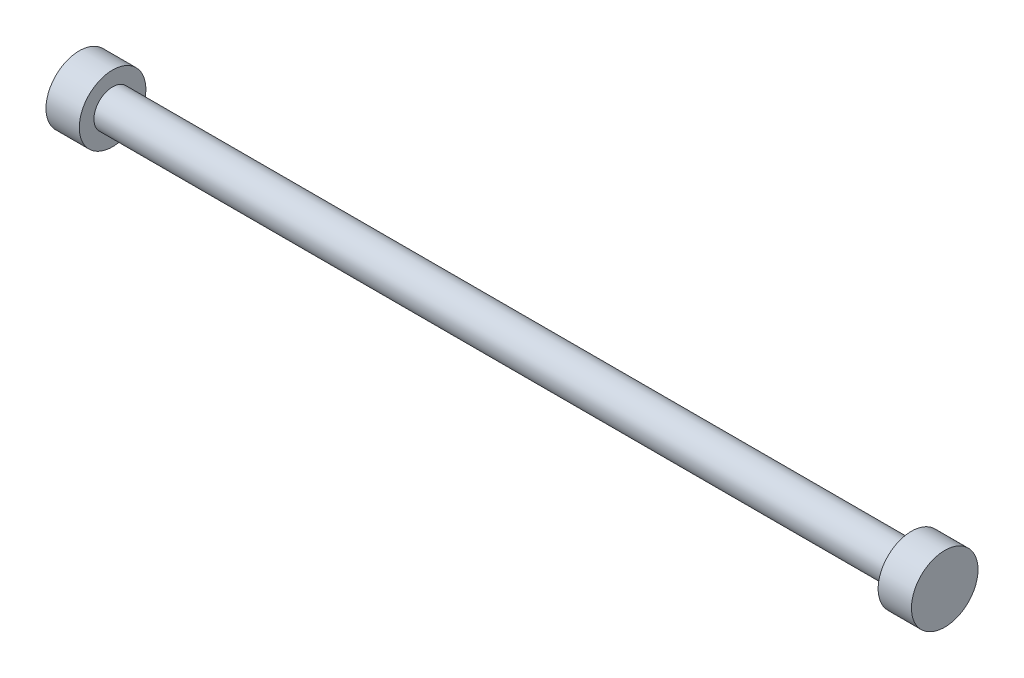
ISO-10303-21;
HEADER;
FILE_DESCRIPTION(('STEP AP214'),'2;1');
FILE_NAME('part.step','',(''),(''),'','','');
FILE_SCHEMA(('AUTOMOTIVE_DESIGN { 1 0 10303 214 1 1 1 1 }'));
ENDSEC;
DATA;
#1=APPLICATION_CONTEXT('core data for automotive mechanical design processes');
#2=APPLICATION_PROTOCOL_DEFINITION('international standard','automotive_design',2000,#1);
#3=PRODUCT_CONTEXT('',#1,'mechanical');
#4=PRODUCT('Part','Part','',(#3));
#5=PRODUCT_RELATED_PRODUCT_CATEGORY('part','',(#4));
#6=PRODUCT_DEFINITION_FORMATION('','',#4);
#7=PRODUCT_DEFINITION_CONTEXT('part definition',#1,'design');
#8=PRODUCT_DEFINITION('design','',#6,#7);
#9=PRODUCT_DEFINITION_SHAPE('','',#8);
#10=(LENGTH_UNIT() NAMED_UNIT(*) SI_UNIT(.MILLI.,.METRE.));
#11=(NAMED_UNIT(*) PLANE_ANGLE_UNIT() SI_UNIT($,.RADIAN.));
#12=(NAMED_UNIT(*) SI_UNIT($,.STERADIAN.) SOLID_ANGLE_UNIT());
#13=UNCERTAINTY_MEASURE_WITH_UNIT(LENGTH_MEASURE(1.E-05),#10,'distance_accuracy_value','');
#14=(GEOMETRIC_REPRESENTATION_CONTEXT(3) GLOBAL_UNCERTAINTY_ASSIGNED_CONTEXT((#13)) GLOBAL_UNIT_ASSIGNED_CONTEXT((#10,
#11,#12)) REPRESENTATION_CONTEXT('',''));
#15=CARTESIAN_POINT('',(0.,0.,0.));
#16=DIRECTION('',(0.,0.,1.));
#17=DIRECTION('',(1.,0.,0.));
#18=AXIS2_PLACEMENT_3D('',#15,#16,#17);
#19=CARTESIAN_POINT('',(76.2,0.,0.));
#20=DIRECTION('',(-1.,0.,0.));
#21=DIRECTION('',(0.,0.,1.));
#22=AXIS2_PLACEMENT_3D('',#19,#20,#21);
#23=CYLINDRICAL_SURFACE('',#22,1.778);
#24=CARTESIAN_POINT('',(76.2,0.,0.));
#25=DIRECTION('',(1.,0.,0.));
#26=DIRECTION('',(0.,0.,-1.));
#27=AXIS2_PLACEMENT_3D('',#24,#25,#26);
#28=CIRCLE('',#27,1.778);
#29=CARTESIAN_POINT('',(76.2,0.,1.778));
#30=VERTEX_POINT('',#29);
#31=EDGE_CURVE('E10',#30,#30,#28,.T.);
#32=CARTESIAN_POINT('',(0.,0.,0.));
#33=DIRECTION('',(1.,0.,0.));
#34=DIRECTION('',(0.,0.,-1.));
#35=AXIS2_PLACEMENT_3D('',#32,#33,#34);
#36=CIRCLE('',#35,1.778);
#37=CARTESIAN_POINT('',(0.,0.,1.778));
#38=VERTEX_POINT('',#37);
#39=EDGE_CURVE('E37',#38,#38,#36,.T.);
#40=CARTESIAN_POINT('',(76.2,0.,1.778));
#41=CARTESIAN_POINT('',(75.40625,0.,1.778));
#42=CARTESIAN_POINT('',(74.6125,0.,1.778));
#43=CARTESIAN_POINT('',(73.025,0.,1.778));
#44=CARTESIAN_POINT('',(72.23125,0.,1.778));
#45=CARTESIAN_POINT('',(70.64375,0.,1.778));
#46=CARTESIAN_POINT('',(69.85,0.,1.778));
#47=CARTESIAN_POINT('',(68.2625,0.,1.778));
#48=CARTESIAN_POINT('',(67.46875,0.,1.778));
#49=CARTESIAN_POINT('',(65.88125,0.,1.778));
#50=CARTESIAN_POINT('',(65.0875,0.,1.778));
#51=CARTESIAN_POINT('',(63.5,0.,1.778));
#52=CARTESIAN_POINT('',(62.70625,0.,1.778));
#53=CARTESIAN_POINT('',(61.11875,0.,1.778));
#54=CARTESIAN_POINT('',(60.325,0.,1.778));
#55=CARTESIAN_POINT('',(58.7375,0.,1.778));
#56=CARTESIAN_POINT('',(57.94375,0.,1.778));
#57=CARTESIAN_POINT('',(56.35625,0.,1.778));
#58=CARTESIAN_POINT('',(55.5625,0.,1.778));
#59=CARTESIAN_POINT('',(53.975,0.,1.778));
#60=CARTESIAN_POINT('',(53.18125,0.,1.778));
#61=CARTESIAN_POINT('',(51.59375,0.,1.778));
#62=CARTESIAN_POINT('',(50.8,0.,1.778));
#63=CARTESIAN_POINT('',(49.2125,0.,1.778));
#64=CARTESIAN_POINT('',(48.41875,0.,1.778));
#65=CARTESIAN_POINT('',(46.83125,0.,1.778));
#66=CARTESIAN_POINT('',(46.0375,0.,1.778));
#67=CARTESIAN_POINT('',(44.45,0.,1.778));
#68=CARTESIAN_POINT('',(43.65625,0.,1.778));
#69=CARTESIAN_POINT('',(42.06875,0.,1.778));
#70=CARTESIAN_POINT('',(41.275,0.,1.778));
#71=CARTESIAN_POINT('',(39.6875,0.,1.778));
#72=CARTESIAN_POINT('',(38.89375,0.,1.778));
#73=CARTESIAN_POINT('',(37.30625,0.,1.778));
#74=CARTESIAN_POINT('',(36.5125,0.,1.778));
#75=CARTESIAN_POINT('',(34.925,0.,1.778));
#76=CARTESIAN_POINT('',(34.13125,0.,1.778));
#77=CARTESIAN_POINT('',(32.54375,0.,1.778));
#78=CARTESIAN_POINT('',(31.75,0.,1.778));
#79=CARTESIAN_POINT('',(30.1625,0.,1.778));
#80=CARTESIAN_POINT('',(29.36875,0.,1.778));
#81=CARTESIAN_POINT('',(27.78125,0.,1.778));
#82=CARTESIAN_POINT('',(26.9875,0.,1.778));
#83=CARTESIAN_POINT('',(25.4,0.,1.778));
#84=CARTESIAN_POINT('',(24.60625,0.,1.778));
#85=CARTESIAN_POINT('',(23.01875,0.,1.778));
#86=CARTESIAN_POINT('',(22.225,0.,1.778));
#87=CARTESIAN_POINT('',(20.6375,0.,1.778));
#88=CARTESIAN_POINT('',(19.84375,0.,1.778));
#89=CARTESIAN_POINT('',(18.25625,0.,1.778));
#90=CARTESIAN_POINT('',(17.4625,0.,1.778));
#91=CARTESIAN_POINT('',(15.875,0.,1.778));
#92=CARTESIAN_POINT('',(15.08125,0.,1.778));
#93=CARTESIAN_POINT('',(13.49375,0.,1.778));
#94=CARTESIAN_POINT('',(12.7,0.,1.778));
#95=CARTESIAN_POINT('',(11.1125,0.,1.778));
#96=CARTESIAN_POINT('',(10.31875,0.,1.778));
#97=CARTESIAN_POINT('',(8.73125,0.,1.778));
#98=CARTESIAN_POINT('',(7.93750000000001,0.,1.778));
#99=CARTESIAN_POINT('',(6.35,0.,1.778));
#100=CARTESIAN_POINT('',(5.55625,0.,1.778));
#101=CARTESIAN_POINT('',(3.96875,0.,1.778));
#102=CARTESIAN_POINT('',(3.175,0.,1.778));
#103=CARTESIAN_POINT('',(1.5875,0.,1.778));
#104=CARTESIAN_POINT('',(0.793750000000001,0.,1.778));
#105=CARTESIAN_POINT('',(0.,0.,1.778));
#106=B_SPLINE_CURVE_WITH_KNOTS('',3,(#40,#41,#42,#43,#44,#45,#46,#47,#48,#49,#50,#51,#52,#53,
#54,#55,#56,#57,#58,#59,#60,#61,#62,#63,#64,#65,#66,#67,#68,#69,#70,#71,#72,#73,#74,#75,#76,#77,
#78,#79,#80,#81,#82,#83,#84,#85,#86,#87,#88,#89,#90,#91,#92,#93,#94,#95,#96,#97,#98,#99,#100,
#101,#102,#103,#104,#105),.UNSPECIFIED.,.F.,.F.,(4,2,2,2,2,2,2,2,2,2,2,2,2,2,2,2,2,2,2,2,2,2,2,
2,2,2,2,2,2,2,2,2,4),(0.,2.38124999999999,4.76249999999999,7.14374999999999,9.52499999999999,
11.90625,14.2875,16.66875,19.05,21.43125,23.8125,26.19375,28.575,30.95625,33.3375,35.71875,38.1,
40.48125,42.8625,45.24375,47.625,50.00625,52.3875,54.76875,57.15,59.53125,61.9125,64.29375,
66.675,69.05625,71.4375,73.81875,76.2),.UNSPECIFIED.);
#107=EDGE_CURVE('BSEAM34',#30,#38,#106,.T.);
#108=ORIENTED_EDGE('',*,*,#31,.F.);
#109=ORIENTED_EDGE('',*,*,#39,.T.);
#110=ORIENTED_EDGE('',*,*,#107,.T.);
#111=ORIENTED_EDGE('',*,*,#107,.F.);
#112=EDGE_LOOP('',(#108,#110,#109,#111));
#113=FACE_BOUND('',#112,.T.);
#114=ADVANCED_FACE('F34',(#113),#23,.T.);
#115=CARTESIAN_POINT('',(-3.175,0.,0.));
#116=DIRECTION('',(1.,0.,0.));
#117=DIRECTION('',(0.,0.,-1.));
#118=AXIS2_PLACEMENT_3D('',#115,#116,#117);
#119=CYLINDRICAL_SURFACE('',#118,3.175);
#120=CARTESIAN_POINT('',(-3.175,0.,0.));
#121=DIRECTION('',(-1.,0.,0.));
#122=DIRECTION('',(0.,0.,1.));
#123=AXIS2_PLACEMENT_3D('',#120,#121,#122);
#124=CIRCLE('',#123,3.175);
#125=CARTESIAN_POINT('',(-3.175,0.,3.175));
#126=VERTEX_POINT('',#125);
#127=EDGE_CURVE('E44',#126,#126,#124,.T.);
#128=ORIENTED_EDGE('',*,*,#127,.F.);
#129=EDGE_LOOP('',(#128));
#130=FACE_BOUND('',#129,.T.);
#131=CARTESIAN_POINT('',(0.,0.,0.));
#132=DIRECTION('',(-1.,0.,0.));
#133=DIRECTION('',(0.,0.,1.));
#134=AXIS2_PLACEMENT_3D('',#131,#132,#133);
#135=CIRCLE('',#134,3.175);
#136=CARTESIAN_POINT('',(0.,0.,3.175));
#137=VERTEX_POINT('',#136);
#138=EDGE_CURVE('E46',#137,#137,#135,.T.);
#139=ORIENTED_EDGE('',*,*,#138,.T.);
#140=EDGE_LOOP('',(#139));
#141=FACE_BOUND('',#140,.T.);
#142=ADVANCED_FACE('F75',(#130,#141),#119,.T.);
#143=CARTESIAN_POINT('',(-3.175,0.,0.));
#144=DIRECTION('',(-1.,0.,0.));
#145=DIRECTION('',(0.,0.,1.));
#146=AXIS2_PLACEMENT_3D('',#143,#144,#145);
#147=PLANE('',#146);
#148=ORIENTED_EDGE('',*,*,#127,.T.);
#149=EDGE_LOOP('',(#148));
#150=FACE_BOUND('',#149,.T.);
#151=ADVANCED_FACE('F80',(#150),#147,.T.);
#152=CARTESIAN_POINT('',(0.,0.,0.));
#153=DIRECTION('',(-1.,0.,0.));
#154=DIRECTION('',(0.,0.,1.));
#155=AXIS2_PLACEMENT_3D('',#152,#153,#154);
#156=PLANE('',#155);
#157=ORIENTED_EDGE('',*,*,#39,.F.);
#158=EDGE_LOOP('',(#157));
#159=FACE_BOUND('',#158,.T.);
#160=ORIENTED_EDGE('',*,*,#138,.F.);
#161=EDGE_LOOP('',(#160));
#162=FACE_BOUND('',#161,.T.);
#163=ADVANCED_FACE('F63',(#159,#162),#156,.F.);
#164=CARTESIAN_POINT('',(79.375,0.,0.));
#165=DIRECTION('',(-1.,0.,0.));
#166=DIRECTION('',(0.,0.,1.));
#167=AXIS2_PLACEMENT_3D('',#164,#165,#166);
#168=CYLINDRICAL_SURFACE('',#167,3.175);
#169=CARTESIAN_POINT('',(79.375,0.,0.));
#170=DIRECTION('',(1.,0.,0.));
#171=DIRECTION('',(0.,0.,-1.));
#172=AXIS2_PLACEMENT_3D('',#169,#170,#171);
#173=CIRCLE('',#172,3.175);
#174=CARTESIAN_POINT('',(79.375,0.,-3.175));
#175=VERTEX_POINT('',#174);
#176=EDGE_CURVE('E49',#175,#175,#173,.T.);
#177=ORIENTED_EDGE('',*,*,#176,.F.);
#178=EDGE_LOOP('',(#177));
#179=FACE_BOUND('',#178,.T.);
#180=CARTESIAN_POINT('',(76.2,0.,0.));
#181=DIRECTION('',(1.,0.,0.));
#182=DIRECTION('',(0.,0.,-1.));
#183=AXIS2_PLACEMENT_3D('',#180,#181,#182);
#184=CIRCLE('',#183,3.175);
#185=CARTESIAN_POINT('',(76.2,0.,-3.175));
#186=VERTEX_POINT('',#185);
#187=EDGE_CURVE('E52',#186,#186,#184,.T.);
#188=ORIENTED_EDGE('',*,*,#187,.T.);
#189=EDGE_LOOP('',(#188));
#190=FACE_BOUND('',#189,.T.);
#191=ADVANCED_FACE('F60',(#179,#190),#168,.T.);
#192=CARTESIAN_POINT('',(79.375,0.,0.));
#193=DIRECTION('',(1.,0.,0.));
#194=DIRECTION('',(0.,0.,-1.));
#195=AXIS2_PLACEMENT_3D('',#192,#193,#194);
#196=PLANE('',#195);
#197=ORIENTED_EDGE('',*,*,#176,.T.);
#198=EDGE_LOOP('',(#197));
#199=FACE_BOUND('',#198,.T.);
#200=ADVANCED_FACE('F58',(#199),#196,.T.);
#201=CARTESIAN_POINT('',(76.2,0.,0.));
#202=DIRECTION('',(1.,0.,0.));
#203=DIRECTION('',(0.,0.,-1.));
#204=AXIS2_PLACEMENT_3D('',#201,#202,#203);
#205=PLANE('',#204);
#206=ORIENTED_EDGE('',*,*,#31,.T.);
#207=EDGE_LOOP('',(#206));
#208=FACE_BOUND('',#207,.T.);
#209=ORIENTED_EDGE('',*,*,#187,.F.);
#210=EDGE_LOOP('',(#209));
#211=FACE_BOUND('',#210,.T.);
#212=ADVANCED_FACE('F67',(#208,#211),#205,.F.);
#213=CLOSED_SHELL('',(#114,#142,#151,#163,#191,#200,#212));
#214=MANIFOLD_SOLID_BREP('B2',#213);
#215=ADVANCED_BREP_SHAPE_REPRESENTATION('',(#18,#214),#14);
#216=SHAPE_DEFINITION_REPRESENTATION(#9,#215);
ENDSEC;
END-ISO-10303-21;
